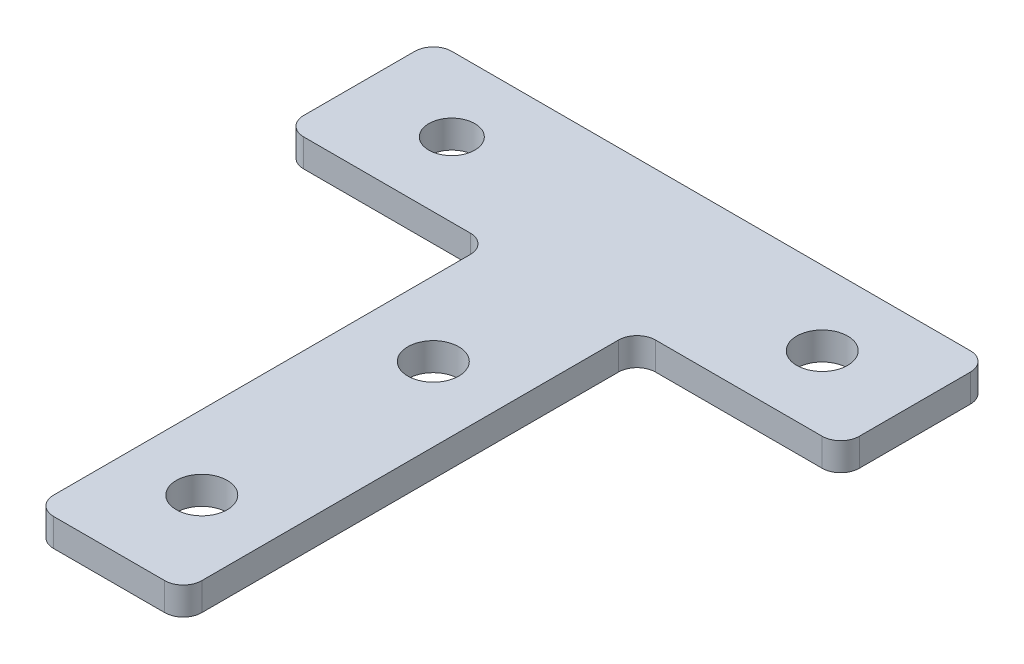
ISO-10303-21;
HEADER;
FILE_DESCRIPTION(('STEP AP214'),'2;1');
FILE_NAME('part.step','',(''),(''),'','','');
FILE_SCHEMA(('AUTOMOTIVE_DESIGN { 1 0 10303 214 1 1 1 1 }'));
ENDSEC;
DATA;
#1=APPLICATION_CONTEXT('core data for automotive mechanical design processes');
#2=APPLICATION_PROTOCOL_DEFINITION('international standard','automotive_design',2000,#1);
#3=PRODUCT_CONTEXT('',#1,'mechanical');
#4=PRODUCT('Part','Part','',(#3));
#5=PRODUCT_RELATED_PRODUCT_CATEGORY('part','',(#4));
#6=PRODUCT_DEFINITION_FORMATION('','',#4);
#7=PRODUCT_DEFINITION_CONTEXT('part definition',#1,'design');
#8=PRODUCT_DEFINITION('design','',#6,#7);
#9=PRODUCT_DEFINITION_SHAPE('','',#8);
#10=(LENGTH_UNIT() NAMED_UNIT(*) SI_UNIT(.MILLI.,.METRE.));
#11=(NAMED_UNIT(*) PLANE_ANGLE_UNIT() SI_UNIT($,.RADIAN.));
#12=(NAMED_UNIT(*) SI_UNIT($,.STERADIAN.) SOLID_ANGLE_UNIT());
#13=UNCERTAINTY_MEASURE_WITH_UNIT(LENGTH_MEASURE(1.E-05),#10,'distance_accuracy_value','');
#14=(GEOMETRIC_REPRESENTATION_CONTEXT(3) GLOBAL_UNCERTAINTY_ASSIGNED_CONTEXT((#13)) GLOBAL_UNIT_ASSIGNED_CONTEXT((#10,
#11,#12)) REPRESENTATION_CONTEXT('',''));
#15=CARTESIAN_POINT('',(0.,0.,0.));
#16=DIRECTION('',(0.,0.,1.));
#17=DIRECTION('',(1.,0.,0.));
#18=AXIS2_PLACEMENT_3D('',#15,#16,#17);
#19=CARTESIAN_POINT('',(20.,3.,18.));
#20=DIRECTION('',(0.,-1.,0.));
#21=DIRECTION('',(0.,0.,-1.));
#22=AXIS2_PLACEMENT_3D('',#19,#20,#21);
#23=PLANE('',#22);
#24=CARTESIAN_POINT('',(20.,3.,18.));
#25=DIRECTION('',(0.,-1.,0.));
#26=DIRECTION('',(0.,0.,-1.));
#27=AXIS2_PLACEMENT_3D('',#24,#25,#26);
#28=CIRCLE('',#27,2.00000000000012);
#29=CARTESIAN_POINT('',(20.,3.,15.9999999999997));
#30=VERTEX_POINT('',#29);
#31=CARTESIAN_POINT('',(22.,3.,18.));
#32=VERTEX_POINT('',#31);
#33=EDGE_CURVE('E242',#30,#32,#28,.T.);
#34=ORIENTED_EDGE('',*,*,#33,.T.);
#35=DIRECTION('',(0.,0.,1.));
#36=VECTOR('',#35,1.);
#37=CARTESIAN_POINT('',(22.,3.,18.));
#38=LINE('',#37,#36);
#39=CARTESIAN_POINT('',(22.,3.,63.));
#40=VERTEX_POINT('',#39);
#41=EDGE_CURVE('E130',#32,#40,#38,.T.);
#42=ORIENTED_EDGE('',*,*,#41,.T.);
#43=CARTESIAN_POINT('',(24.,3.,63.));
#44=DIRECTION('',(0.,1.,0.));
#45=DIRECTION('',(0.,0.,1.));
#46=AXIS2_PLACEMENT_3D('',#43,#44,#45);
#47=CIRCLE('',#46,2.);
#48=CARTESIAN_POINT('',(24.,3.,65.));
#49=VERTEX_POINT('',#48);
#50=EDGE_CURVE('E295',#40,#49,#47,.T.);
#51=ORIENTED_EDGE('',*,*,#50,.T.);
#52=DIRECTION('',(1.,0.,0.));
#53=VECTOR('',#52,1.);
#54=CARTESIAN_POINT('',(24.,3.,65.));
#55=LINE('',#54,#53);
#56=CARTESIAN_POINT('',(36.,3.,65.));
#57=VERTEX_POINT('',#56);
#58=EDGE_CURVE('E315',#49,#57,#55,.T.);
#59=ORIENTED_EDGE('',*,*,#58,.T.);
#60=CARTESIAN_POINT('',(36.,3.,63.));
#61=DIRECTION('',(0.,1.,0.));
#62=DIRECTION('',(0.,0.,1.));
#63=AXIS2_PLACEMENT_3D('',#60,#61,#62);
#64=CIRCLE('',#63,2.);
#65=CARTESIAN_POINT('',(38.,3.,63.));
#66=VERTEX_POINT('',#65);
#67=EDGE_CURVE('E311',#57,#66,#64,.T.);
#68=ORIENTED_EDGE('',*,*,#67,.T.);
#69=DIRECTION('',(0.,0.,-1.));
#70=VECTOR('',#69,1.);
#71=CARTESIAN_POINT('',(38.,3.,63.));
#72=LINE('',#71,#70);
#73=CARTESIAN_POINT('',(38.,3.,18.));
#74=VERTEX_POINT('',#73);
#75=EDGE_CURVE('E314',#66,#74,#72,.T.);
#76=ORIENTED_EDGE('',*,*,#75,.T.);
#77=CARTESIAN_POINT('',(40.,3.,18.));
#78=DIRECTION('',(0.,-1.,0.));
#79=DIRECTION('',(0.,0.,-1.));
#80=AXIS2_PLACEMENT_3D('',#77,#78,#79);
#81=CIRCLE('',#80,2.);
#82=CARTESIAN_POINT('',(40.,3.,16.));
#83=VERTEX_POINT('',#82);
#84=EDGE_CURVE('E319',#74,#83,#81,.T.);
#85=ORIENTED_EDGE('',*,*,#84,.T.);
#86=DIRECTION('',(1.,0.,0.));
#87=VECTOR('',#86,1.);
#88=CARTESIAN_POINT('',(40.,3.,16.));
#89=LINE('',#88,#87);
#90=CARTESIAN_POINT('',(58.,3.,16.));
#91=VERTEX_POINT('',#90);
#92=EDGE_CURVE('E326',#83,#91,#89,.T.);
#93=ORIENTED_EDGE('',*,*,#92,.T.);
#94=CARTESIAN_POINT('',(58.,3.,14.));
#95=DIRECTION('',(0.,1.,0.));
#96=DIRECTION('',(0.,0.,1.));
#97=AXIS2_PLACEMENT_3D('',#94,#95,#96);
#98=CIRCLE('',#97,2.);
#99=CARTESIAN_POINT('',(60.,3.,14.));
#100=VERTEX_POINT('',#99);
#101=EDGE_CURVE('E329',#91,#100,#98,.T.);
#102=ORIENTED_EDGE('',*,*,#101,.T.);
#103=DIRECTION('',(0.,0.,-1.));
#104=VECTOR('',#103,1.);
#105=CARTESIAN_POINT('',(60.,3.,14.));
#106=LINE('',#105,#104);
#107=CARTESIAN_POINT('',(60.,3.,2.00000000000001));
#108=VERTEX_POINT('',#107);
#109=EDGE_CURVE('E332',#100,#108,#106,.T.);
#110=ORIENTED_EDGE('',*,*,#109,.T.);
#111=CARTESIAN_POINT('',(58.,3.,2.));
#112=DIRECTION('',(0.,1.,0.));
#113=DIRECTION('',(0.,0.,1.));
#114=AXIS2_PLACEMENT_3D('',#111,#112,#113);
#115=CIRCLE('',#114,2.);
#116=CARTESIAN_POINT('',(58.,3.,0.));
#117=VERTEX_POINT('',#116);
#118=EDGE_CURVE('E335',#108,#117,#115,.T.);
#119=ORIENTED_EDGE('',*,*,#118,.T.);
#120=DIRECTION('',(-1.,0.,0.));
#121=VECTOR('',#120,1.);
#122=CARTESIAN_POINT('',(58.,3.,0.));
#123=LINE('',#122,#121);
#124=CARTESIAN_POINT('',(2.,3.,0.));
#125=VERTEX_POINT('',#124);
#126=EDGE_CURVE('E338',#117,#125,#123,.T.);
#127=ORIENTED_EDGE('',*,*,#126,.T.);
#128=CARTESIAN_POINT('',(2.,3.,2.));
#129=DIRECTION('',(0.,1.,0.));
#130=DIRECTION('',(0.,0.,-1.));
#131=AXIS2_PLACEMENT_3D('',#128,#129,#130);
#132=CIRCLE('',#131,2.);
#133=CARTESIAN_POINT('',(0.,3.,2.00000000000001));
#134=VERTEX_POINT('',#133);
#135=EDGE_CURVE('E173',#125,#134,#132,.T.);
#136=ORIENTED_EDGE('',*,*,#135,.T.);
#137=DIRECTION('',(0.,0.,1.));
#138=VECTOR('',#137,1.);
#139=CARTESIAN_POINT('',(0.,3.,2.00000000000001));
#140=LINE('',#139,#138);
#141=CARTESIAN_POINT('',(0.,3.,14.));
#142=VERTEX_POINT('',#141);
#143=EDGE_CURVE('E167',#134,#142,#140,.T.);
#144=ORIENTED_EDGE('',*,*,#143,.T.);
#145=CARTESIAN_POINT('',(2.,3.,14.));
#146=DIRECTION('',(0.,1.,0.));
#147=DIRECTION('',(0.,0.,1.));
#148=AXIS2_PLACEMENT_3D('',#145,#146,#147);
#149=CIRCLE('',#148,2.);
#150=CARTESIAN_POINT('',(2.00000000000003,3.,16.));
#151=VERTEX_POINT('',#150);
#152=EDGE_CURVE('E171',#142,#151,#149,.T.);
#153=ORIENTED_EDGE('',*,*,#152,.T.);
#154=DIRECTION('',(1.,0.,0.));
#155=VECTOR('',#154,1.);
#156=CARTESIAN_POINT('',(2.00000000000003,3.,16.));
#157=LINE('',#156,#155);
#158=EDGE_CURVE('E63',#151,#30,#157,.T.);
#159=ORIENTED_EDGE('',*,*,#158,.T.);
#160=EDGE_LOOP('',(#34,#42,#51,#59,#68,#76,#85,#93,#102,#110,#119,#127,#136,#144,#153,#159));
#161=FACE_BOUND('',#160,.T.);
#162=CARTESIAN_POINT('',(10.,3.,8.));
#163=DIRECTION('',(0.,1.,0.));
#164=DIRECTION('',(0.,0.,1.));
#165=AXIS2_PLACEMENT_3D('',#162,#163,#164);
#166=CIRCLE('',#165,2.48553592422511);
#167=CARTESIAN_POINT('',(10.,3.,10.4855359242251));
#168=VERTEX_POINT('',#167);
#169=EDGE_CURVE('E200',#168,#168,#166,.T.);
#170=ORIENTED_EDGE('',*,*,#169,.F.);
#171=EDGE_LOOP('',(#170));
#172=FACE_BOUND('',#171,.T.);
#173=CARTESIAN_POINT('',(50.,3.,8.));
#174=DIRECTION('',(0.,1.,0.));
#175=DIRECTION('',(0.,0.,1.));
#176=AXIS2_PLACEMENT_3D('',#173,#174,#175);
#177=CIRCLE('',#176,2.75);
#178=CARTESIAN_POINT('',(50.,3.,10.75));
#179=VERTEX_POINT('',#178);
#180=EDGE_CURVE('E408',#179,#179,#177,.T.);
#181=ORIENTED_EDGE('',*,*,#180,.F.);
#182=EDGE_LOOP('',(#181));
#183=FACE_BOUND('',#182,.T.);
#184=CARTESIAN_POINT('',(30.,3.,55.));
#185=DIRECTION('',(0.,1.,0.));
#186=DIRECTION('',(0.,0.,1.));
#187=AXIS2_PLACEMENT_3D('',#184,#185,#186);
#188=CIRCLE('',#187,2.75);
#189=CARTESIAN_POINT('',(30.,3.,57.75));
#190=VERTEX_POINT('',#189);
#191=EDGE_CURVE('E400',#190,#190,#188,.T.);
#192=ORIENTED_EDGE('',*,*,#191,.F.);
#193=EDGE_LOOP('',(#192));
#194=FACE_BOUND('',#193,.T.);
#195=CARTESIAN_POINT('',(30.,3.,30.));
#196=DIRECTION('',(0.,1.,0.));
#197=DIRECTION('',(0.,0.,1.));
#198=AXIS2_PLACEMENT_3D('',#195,#196,#197);
#199=CIRCLE('',#198,2.75);
#200=CARTESIAN_POINT('',(30.,3.,32.75));
#201=VERTEX_POINT('',#200);
#202=EDGE_CURVE('E389',#201,#201,#199,.T.);
#203=ORIENTED_EDGE('',*,*,#202,.F.);
#204=EDGE_LOOP('',(#203));
#205=FACE_BOUND('',#204,.T.);
#206=ADVANCED_FACE('F45',(#161,#172,#183,#194,#205),#23,.F.);
#207=CARTESIAN_POINT('',(20.,0.,18.));
#208=DIRECTION('',(0.,-1.,0.));
#209=DIRECTION('',(0.,0.,-1.));
#210=AXIS2_PLACEMENT_3D('',#207,#208,#209);
#211=PLANE('',#210);
#212=CARTESIAN_POINT('',(30.,0.,55.));
#213=DIRECTION('',(0.,1.,0.));
#214=DIRECTION('',(0.,0.,1.));
#215=AXIS2_PLACEMENT_3D('',#212,#213,#214);
#216=CIRCLE('',#215,2.75);
#217=CARTESIAN_POINT('',(30.,0.,57.75));
#218=VERTEX_POINT('',#217);
#219=EDGE_CURVE('E397',#218,#218,#216,.T.);
#220=ORIENTED_EDGE('',*,*,#219,.T.);
#221=EDGE_LOOP('',(#220));
#222=FACE_BOUND('',#221,.T.);
#223=CARTESIAN_POINT('',(10.,0.,8.));
#224=DIRECTION('',(0.,1.,0.));
#225=DIRECTION('',(0.,0.,1.));
#226=AXIS2_PLACEMENT_3D('',#223,#224,#225);
#227=CIRCLE('',#226,2.48553592422511);
#228=CARTESIAN_POINT('',(10.,0.,10.4855359242251));
#229=VERTEX_POINT('',#228);
#230=EDGE_CURVE('E412',#229,#229,#227,.T.);
#231=ORIENTED_EDGE('',*,*,#230,.T.);
#232=EDGE_LOOP('',(#231));
#233=FACE_BOUND('',#232,.T.);
#234=CARTESIAN_POINT('',(20.,0.,18.));
#235=DIRECTION('',(0.,-1.,0.));
#236=DIRECTION('',(0.,0.,-1.));
#237=AXIS2_PLACEMENT_3D('',#234,#235,#236);
#238=CIRCLE('',#237,2.00000000000012);
#239=CARTESIAN_POINT('',(20.,0.,15.9999999999997));
#240=VERTEX_POINT('',#239);
#241=CARTESIAN_POINT('',(22.,0.,18.));
#242=VERTEX_POINT('',#241);
#243=EDGE_CURVE('E195',#240,#242,#238,.T.);
#244=ORIENTED_EDGE('',*,*,#243,.F.);
#245=DIRECTION('',(1.,0.,0.));
#246=VECTOR('',#245,1.);
#247=CARTESIAN_POINT('',(2.00000000000003,0.,16.));
#248=LINE('',#247,#246);
#249=CARTESIAN_POINT('',(2.00000000000003,0.,16.));
#250=VERTEX_POINT('',#249);
#251=EDGE_CURVE('E122',#250,#240,#248,.T.);
#252=ORIENTED_EDGE('',*,*,#251,.F.);
#253=CARTESIAN_POINT('',(2.,0.,14.));
#254=DIRECTION('',(0.,1.,0.));
#255=DIRECTION('',(0.,0.,1.));
#256=AXIS2_PLACEMENT_3D('',#253,#254,#255);
#257=CIRCLE('',#256,2.);
#258=CARTESIAN_POINT('',(0.,0.,14.));
#259=VERTEX_POINT('',#258);
#260=EDGE_CURVE('E116',#259,#250,#257,.T.);
#261=ORIENTED_EDGE('',*,*,#260,.F.);
#262=DIRECTION('',(0.,0.,1.));
#263=VECTOR('',#262,1.);
#264=CARTESIAN_POINT('',(0.,0.,2.00000000000001));
#265=LINE('',#264,#263);
#266=CARTESIAN_POINT('',(0.,0.,2.00000000000001));
#267=VERTEX_POINT('',#266);
#268=EDGE_CURVE('E182',#267,#259,#265,.T.);
#269=ORIENTED_EDGE('',*,*,#268,.F.);
#270=CARTESIAN_POINT('',(2.,0.,2.));
#271=DIRECTION('',(0.,1.,0.));
#272=DIRECTION('',(0.,0.,-1.));
#273=AXIS2_PLACEMENT_3D('',#270,#271,#272);
#274=CIRCLE('',#273,2.);
#275=CARTESIAN_POINT('',(2.,0.,0.));
#276=VERTEX_POINT('',#275);
#277=EDGE_CURVE('E233',#276,#267,#274,.T.);
#278=ORIENTED_EDGE('',*,*,#277,.F.);
#279=DIRECTION('',(-1.,0.,0.));
#280=VECTOR('',#279,1.);
#281=CARTESIAN_POINT('',(58.,0.,0.));
#282=LINE('',#281,#280);
#283=CARTESIAN_POINT('',(58.,0.,0.));
#284=VERTEX_POINT('',#283);
#285=EDGE_CURVE('E230',#284,#276,#282,.T.);
#286=ORIENTED_EDGE('',*,*,#285,.F.);
#287=CARTESIAN_POINT('',(58.,0.,2.));
#288=DIRECTION('',(0.,1.,0.));
#289=DIRECTION('',(0.,0.,1.));
#290=AXIS2_PLACEMENT_3D('',#287,#288,#289);
#291=CIRCLE('',#290,2.);
#292=CARTESIAN_POINT('',(60.,0.,2.00000000000001));
#293=VERTEX_POINT('',#292);
#294=EDGE_CURVE('E227',#293,#284,#291,.T.);
#295=ORIENTED_EDGE('',*,*,#294,.F.);
#296=DIRECTION('',(0.,0.,-1.));
#297=VECTOR('',#296,1.);
#298=CARTESIAN_POINT('',(60.,0.,14.));
#299=LINE('',#298,#297);
#300=CARTESIAN_POINT('',(60.,0.,14.));
#301=VERTEX_POINT('',#300);
#302=EDGE_CURVE('E224',#301,#293,#299,.T.);
#303=ORIENTED_EDGE('',*,*,#302,.F.);
#304=CARTESIAN_POINT('',(58.,0.,14.));
#305=DIRECTION('',(0.,1.,0.));
#306=DIRECTION('',(0.,0.,1.));
#307=AXIS2_PLACEMENT_3D('',#304,#305,#306);
#308=CIRCLE('',#307,2.);
#309=CARTESIAN_POINT('',(58.,0.,16.));
#310=VERTEX_POINT('',#309);
#311=EDGE_CURVE('E221',#310,#301,#308,.T.);
#312=ORIENTED_EDGE('',*,*,#311,.F.);
#313=DIRECTION('',(1.,0.,0.));
#314=VECTOR('',#313,1.);
#315=CARTESIAN_POINT('',(40.,0.,16.));
#316=LINE('',#315,#314);
#317=CARTESIAN_POINT('',(40.,0.,16.));
#318=VERTEX_POINT('',#317);
#319=EDGE_CURVE('E218',#318,#310,#316,.T.);
#320=ORIENTED_EDGE('',*,*,#319,.F.);
#321=CARTESIAN_POINT('',(40.,0.,18.));
#322=DIRECTION('',(0.,-1.,0.));
#323=DIRECTION('',(0.,0.,-1.));
#324=AXIS2_PLACEMENT_3D('',#321,#322,#323);
#325=CIRCLE('',#324,2.);
#326=CARTESIAN_POINT('',(38.,0.,18.));
#327=VERTEX_POINT('',#326);
#328=EDGE_CURVE('E215',#327,#318,#325,.T.);
#329=ORIENTED_EDGE('',*,*,#328,.F.);
#330=DIRECTION('',(0.,0.,-1.));
#331=VECTOR('',#330,1.);
#332=CARTESIAN_POINT('',(38.,0.,63.));
#333=LINE('',#332,#331);
#334=CARTESIAN_POINT('',(38.,0.,63.));
#335=VERTEX_POINT('',#334);
#336=EDGE_CURVE('E212',#335,#327,#333,.T.);
#337=ORIENTED_EDGE('',*,*,#336,.F.);
#338=CARTESIAN_POINT('',(36.,0.,63.));
#339=DIRECTION('',(0.,1.,0.));
#340=DIRECTION('',(0.,0.,1.));
#341=AXIS2_PLACEMENT_3D('',#338,#339,#340);
#342=CIRCLE('',#341,2.);
#343=CARTESIAN_POINT('',(36.,0.,65.));
#344=VERTEX_POINT('',#343);
#345=EDGE_CURVE('E209',#344,#335,#342,.T.);
#346=ORIENTED_EDGE('',*,*,#345,.F.);
#347=DIRECTION('',(1.,0.,0.));
#348=VECTOR('',#347,1.);
#349=CARTESIAN_POINT('',(24.,0.,65.));
#350=LINE('',#349,#348);
#351=CARTESIAN_POINT('',(24.,0.,65.));
#352=VERTEX_POINT('',#351);
#353=EDGE_CURVE('E206',#352,#344,#350,.T.);
#354=ORIENTED_EDGE('',*,*,#353,.F.);
#355=CARTESIAN_POINT('',(24.,0.,63.));
#356=DIRECTION('',(0.,1.,0.));
#357=DIRECTION('',(0.,0.,1.));
#358=AXIS2_PLACEMENT_3D('',#355,#356,#357);
#359=CIRCLE('',#358,2.);
#360=CARTESIAN_POINT('',(22.,0.,63.));
#361=VERTEX_POINT('',#360);
#362=EDGE_CURVE('E203',#361,#352,#359,.T.);
#363=ORIENTED_EDGE('',*,*,#362,.F.);
#364=DIRECTION('',(0.,0.,1.));
#365=VECTOR('',#364,1.);
#366=CARTESIAN_POINT('',(22.,0.,18.));
#367=LINE('',#366,#365);
#368=EDGE_CURVE('E199',#242,#361,#367,.T.);
#369=ORIENTED_EDGE('',*,*,#368,.F.);
#370=EDGE_LOOP('',(#244,#252,#261,#269,#278,#286,#295,#303,#312,#320,#329,#337,#346,#354,#363,#369));
#371=FACE_BOUND('',#370,.T.);
#372=CARTESIAN_POINT('',(50.,0.,8.));
#373=DIRECTION('',(0.,1.,0.));
#374=DIRECTION('',(0.,0.,1.));
#375=AXIS2_PLACEMENT_3D('',#372,#373,#374);
#376=CIRCLE('',#375,2.75);
#377=CARTESIAN_POINT('',(50.,0.,10.75));
#378=VERTEX_POINT('',#377);
#379=EDGE_CURVE('E404',#378,#378,#376,.T.);
#380=ORIENTED_EDGE('',*,*,#379,.T.);
#381=EDGE_LOOP('',(#380));
#382=FACE_BOUND('',#381,.T.);
#383=CARTESIAN_POINT('',(30.,0.,30.));
#384=DIRECTION('',(0.,1.,0.));
#385=DIRECTION('',(0.,0.,1.));
#386=AXIS2_PLACEMENT_3D('',#383,#384,#385);
#387=CIRCLE('',#386,2.75);
#388=CARTESIAN_POINT('',(30.,0.,32.75));
#389=VERTEX_POINT('',#388);
#390=EDGE_CURVE('E392',#389,#389,#387,.T.);
#391=ORIENTED_EDGE('',*,*,#390,.T.);
#392=EDGE_LOOP('',(#391));
#393=FACE_BOUND('',#392,.T.);
#394=ADVANCED_FACE('F299',(#222,#233,#371,#382,#393),#211,.T.);
#395=CARTESIAN_POINT('',(20.,3.,18.));
#396=DIRECTION('',(0.,-1.,0.));
#397=DIRECTION('',(0.,0.,-1.));
#398=AXIS2_PLACEMENT_3D('',#395,#396,#397);
#399=CYLINDRICAL_SURFACE('',#398,2.00000000000012);
#400=ORIENTED_EDGE('',*,*,#243,.T.);
#401=DIRECTION('',(0.,-1.,0.));
#402=VECTOR('',#401,1.);
#403=CARTESIAN_POINT('',(22.,3.,18.));
#404=LINE('',#403,#402);
#405=EDGE_CURVE('E11',#32,#242,#404,.T.);
#406=ORIENTED_EDGE('',*,*,#405,.F.);
#407=ORIENTED_EDGE('',*,*,#33,.F.);
#408=DIRECTION('',(0.,-1.,0.));
#409=VECTOR('',#408,1.);
#410=CARTESIAN_POINT('',(20.,3.,15.9999999999997));
#411=LINE('',#410,#409);
#412=EDGE_CURVE('E191',#30,#240,#411,.T.);
#413=ORIENTED_EDGE('',*,*,#412,.T.);
#414=EDGE_LOOP('',(#400,#406,#407,#413));
#415=FACE_BOUND('',#414,.T.);
#416=ADVANCED_FACE('F47',(#415),#399,.F.);
#417=CARTESIAN_POINT('',(22.,3.,18.));
#418=DIRECTION('',(1.,0.,0.));
#419=DIRECTION('',(0.,0.,-1.));
#420=AXIS2_PLACEMENT_3D('',#417,#418,#419);
#421=PLANE('',#420);
#422=ORIENTED_EDGE('',*,*,#368,.T.);
#423=DIRECTION('',(0.,-1.,0.));
#424=VECTOR('',#423,1.);
#425=CARTESIAN_POINT('',(22.,3.,63.));
#426=LINE('',#425,#424);
#427=EDGE_CURVE('E55',#40,#361,#426,.T.);
#428=ORIENTED_EDGE('',*,*,#427,.F.);
#429=ORIENTED_EDGE('',*,*,#41,.F.);
#430=ORIENTED_EDGE('',*,*,#405,.T.);
#431=EDGE_LOOP('',(#422,#428,#429,#430));
#432=FACE_BOUND('',#431,.T.);
#433=ADVANCED_FACE('F574',(#432),#421,.F.);
#434=CARTESIAN_POINT('',(24.,3.,63.));
#435=DIRECTION('',(0.,-1.,0.));
#436=DIRECTION('',(0.,0.,-1.));
#437=AXIS2_PLACEMENT_3D('',#434,#435,#436);
#438=CYLINDRICAL_SURFACE('',#437,2.);
#439=ORIENTED_EDGE('',*,*,#362,.T.);
#440=DIRECTION('',(0.,-1.,0.));
#441=VECTOR('',#440,1.);
#442=CARTESIAN_POINT('',(24.,3.,65.));
#443=LINE('',#442,#441);
#444=EDGE_CURVE('E285',#49,#352,#443,.T.);
#445=ORIENTED_EDGE('',*,*,#444,.F.);
#446=ORIENTED_EDGE('',*,*,#50,.F.);
#447=ORIENTED_EDGE('',*,*,#427,.T.);
#448=EDGE_LOOP('',(#439,#445,#446,#447));
#449=FACE_BOUND('',#448,.T.);
#450=ADVANCED_FACE('F293',(#449),#438,.T.);
#451=CARTESIAN_POINT('',(24.,3.,65.));
#452=DIRECTION('',(0.,0.,-1.));
#453=DIRECTION('',(-1.,0.,0.));
#454=AXIS2_PLACEMENT_3D('',#451,#452,#453);
#455=PLANE('',#454);
#456=ORIENTED_EDGE('',*,*,#353,.T.);
#457=DIRECTION('',(0.,-1.,0.));
#458=VECTOR('',#457,1.);
#459=CARTESIAN_POINT('',(36.,3.,65.));
#460=LINE('',#459,#458);
#461=EDGE_CURVE('E281',#57,#344,#460,.T.);
#462=ORIENTED_EDGE('',*,*,#461,.F.);
#463=ORIENTED_EDGE('',*,*,#58,.F.);
#464=ORIENTED_EDGE('',*,*,#444,.T.);
#465=EDGE_LOOP('',(#456,#462,#463,#464));
#466=FACE_BOUND('',#465,.T.);
#467=ADVANCED_FACE('F305',(#466),#455,.F.);
#468=CARTESIAN_POINT('',(36.,3.,63.));
#469=DIRECTION('',(0.,-1.,0.));
#470=DIRECTION('',(0.,0.,-1.));
#471=AXIS2_PLACEMENT_3D('',#468,#469,#470);
#472=CYLINDRICAL_SURFACE('',#471,2.);
#473=ORIENTED_EDGE('',*,*,#345,.T.);
#474=DIRECTION('',(0.,-1.,0.));
#475=VECTOR('',#474,1.);
#476=CARTESIAN_POINT('',(38.,3.,63.));
#477=LINE('',#476,#475);
#478=EDGE_CURVE('E277',#66,#335,#477,.T.);
#479=ORIENTED_EDGE('',*,*,#478,.F.);
#480=ORIENTED_EDGE('',*,*,#67,.F.);
#481=ORIENTED_EDGE('',*,*,#461,.T.);
#482=EDGE_LOOP('',(#473,#479,#480,#481));
#483=FACE_BOUND('',#482,.T.);
#484=ADVANCED_FACE('F309',(#483),#472,.T.);
#485=CARTESIAN_POINT('',(38.,3.,63.));
#486=DIRECTION('',(-1.,0.,0.));
#487=DIRECTION('',(0.,0.,1.));
#488=AXIS2_PLACEMENT_3D('',#485,#486,#487);
#489=PLANE('',#488);
#490=ORIENTED_EDGE('',*,*,#336,.T.);
#491=DIRECTION('',(0.,-1.,0.));
#492=VECTOR('',#491,1.);
#493=CARTESIAN_POINT('',(38.,3.,18.));
#494=LINE('',#493,#492);
#495=EDGE_CURVE('E273',#74,#327,#494,.T.);
#496=ORIENTED_EDGE('',*,*,#495,.F.);
#497=ORIENTED_EDGE('',*,*,#75,.F.);
#498=ORIENTED_EDGE('',*,*,#478,.T.);
#499=EDGE_LOOP('',(#490,#496,#497,#498));
#500=FACE_BOUND('',#499,.T.);
#501=ADVANCED_FACE('F539',(#500),#489,.F.);
#502=CARTESIAN_POINT('',(40.,3.,18.));
#503=DIRECTION('',(0.,-1.,0.));
#504=DIRECTION('',(0.,0.,-1.));
#505=AXIS2_PLACEMENT_3D('',#502,#503,#504);
#506=CYLINDRICAL_SURFACE('',#505,2.);
#507=ORIENTED_EDGE('',*,*,#328,.T.);
#508=DIRECTION('',(0.,-1.,0.));
#509=VECTOR('',#508,1.);
#510=CARTESIAN_POINT('',(40.,3.,16.));
#511=LINE('',#510,#509);
#512=EDGE_CURVE('E269',#83,#318,#511,.T.);
#513=ORIENTED_EDGE('',*,*,#512,.F.);
#514=ORIENTED_EDGE('',*,*,#84,.F.);
#515=ORIENTED_EDGE('',*,*,#495,.T.);
#516=EDGE_LOOP('',(#507,#513,#514,#515));
#517=FACE_BOUND('',#516,.T.);
#518=ADVANCED_FACE('F529',(#517),#506,.F.);
#519=CARTESIAN_POINT('',(40.,3.,16.));
#520=DIRECTION('',(0.,0.,-1.));
#521=DIRECTION('',(-1.,0.,0.));
#522=AXIS2_PLACEMENT_3D('',#519,#520,#521);
#523=PLANE('',#522);
#524=ORIENTED_EDGE('',*,*,#319,.T.);
#525=DIRECTION('',(0.,-1.,0.));
#526=VECTOR('',#525,1.);
#527=CARTESIAN_POINT('',(58.,3.,16.));
#528=LINE('',#527,#526);
#529=EDGE_CURVE('E265',#91,#310,#528,.T.);
#530=ORIENTED_EDGE('',*,*,#529,.F.);
#531=ORIENTED_EDGE('',*,*,#92,.F.);
#532=ORIENTED_EDGE('',*,*,#512,.T.);
#533=EDGE_LOOP('',(#524,#530,#531,#532));
#534=FACE_BOUND('',#533,.T.);
#535=ADVANCED_FACE('F519',(#534),#523,.F.);
#536=CARTESIAN_POINT('',(58.,3.,14.));
#537=DIRECTION('',(0.,-1.,0.));
#538=DIRECTION('',(0.,0.,-1.));
#539=AXIS2_PLACEMENT_3D('',#536,#537,#538);
#540=CYLINDRICAL_SURFACE('',#539,2.);
#541=ORIENTED_EDGE('',*,*,#311,.T.);
#542=DIRECTION('',(0.,-1.,0.));
#543=VECTOR('',#542,1.);
#544=CARTESIAN_POINT('',(60.,3.,14.));
#545=LINE('',#544,#543);
#546=EDGE_CURVE('E261',#100,#301,#545,.T.);
#547=ORIENTED_EDGE('',*,*,#546,.F.);
#548=ORIENTED_EDGE('',*,*,#101,.F.);
#549=ORIENTED_EDGE('',*,*,#529,.T.);
#550=EDGE_LOOP('',(#541,#547,#548,#549));
#551=FACE_BOUND('',#550,.T.);
#552=ADVANCED_FACE('F509',(#551),#540,.T.);
#553=CARTESIAN_POINT('',(60.,3.,14.));
#554=DIRECTION('',(-1.,0.,0.));
#555=DIRECTION('',(0.,0.,1.));
#556=AXIS2_PLACEMENT_3D('',#553,#554,#555);
#557=PLANE('',#556);
#558=ORIENTED_EDGE('',*,*,#302,.T.);
#559=DIRECTION('',(0.,-1.,0.));
#560=VECTOR('',#559,1.);
#561=CARTESIAN_POINT('',(60.,3.,2.00000000000001));
#562=LINE('',#561,#560);
#563=EDGE_CURVE('E257',#108,#293,#562,.T.);
#564=ORIENTED_EDGE('',*,*,#563,.F.);
#565=ORIENTED_EDGE('',*,*,#109,.F.);
#566=ORIENTED_EDGE('',*,*,#546,.T.);
#567=EDGE_LOOP('',(#558,#564,#565,#566));
#568=FACE_BOUND('',#567,.T.);
#569=ADVANCED_FACE('F499',(#568),#557,.F.);
#570=CARTESIAN_POINT('',(58.,3.,2.));
#571=DIRECTION('',(0.,-1.,0.));
#572=DIRECTION('',(0.,0.,-1.));
#573=AXIS2_PLACEMENT_3D('',#570,#571,#572);
#574=CYLINDRICAL_SURFACE('',#573,2.);
#575=ORIENTED_EDGE('',*,*,#294,.T.);
#576=DIRECTION('',(0.,-1.,0.));
#577=VECTOR('',#576,1.);
#578=CARTESIAN_POINT('',(58.,3.,0.));
#579=LINE('',#578,#577);
#580=EDGE_CURVE('E253',#117,#284,#579,.T.);
#581=ORIENTED_EDGE('',*,*,#580,.F.);
#582=ORIENTED_EDGE('',*,*,#118,.F.);
#583=ORIENTED_EDGE('',*,*,#563,.T.);
#584=EDGE_LOOP('',(#575,#581,#582,#583));
#585=FACE_BOUND('',#584,.T.);
#586=ADVANCED_FACE('F490',(#585),#574,.T.);
#587=CARTESIAN_POINT('',(58.,3.,0.));
#588=DIRECTION('',(0.,0.,1.));
#589=DIRECTION('',(1.,0.,0.));
#590=AXIS2_PLACEMENT_3D('',#587,#588,#589);
#591=PLANE('',#590);
#592=ORIENTED_EDGE('',*,*,#285,.T.);
#593=DIRECTION('',(0.,-1.,0.));
#594=VECTOR('',#593,1.);
#595=CARTESIAN_POINT('',(2.,3.,0.));
#596=LINE('',#595,#594);
#597=EDGE_CURVE('E249',#125,#276,#596,.T.);
#598=ORIENTED_EDGE('',*,*,#597,.F.);
#599=ORIENTED_EDGE('',*,*,#126,.F.);
#600=ORIENTED_EDGE('',*,*,#580,.T.);
#601=EDGE_LOOP('',(#592,#598,#599,#600));
#602=FACE_BOUND('',#601,.T.);
#603=ADVANCED_FACE('F346',(#602),#591,.F.);
#604=CARTESIAN_POINT('',(2.,3.,2.));
#605=DIRECTION('',(0.,-1.,0.));
#606=DIRECTION('',(0.,0.,-1.));
#607=AXIS2_PLACEMENT_3D('',#604,#605,#606);
#608=CYLINDRICAL_SURFACE('',#607,2.);
#609=ORIENTED_EDGE('',*,*,#277,.T.);
#610=DIRECTION('',(0.,-1.,0.));
#611=VECTOR('',#610,1.);
#612=CARTESIAN_POINT('',(0.,3.,2.00000000000001));
#613=LINE('',#612,#611);
#614=EDGE_CURVE('E184',#134,#267,#613,.T.);
#615=ORIENTED_EDGE('',*,*,#614,.F.);
#616=ORIENTED_EDGE('',*,*,#135,.F.);
#617=ORIENTED_EDGE('',*,*,#597,.T.);
#618=EDGE_LOOP('',(#609,#615,#616,#617));
#619=FACE_BOUND('',#618,.T.);
#620=ADVANCED_FACE('F350',(#619),#608,.T.);
#621=CARTESIAN_POINT('',(0.,3.,2.00000000000001));
#622=DIRECTION('',(1.,0.,0.));
#623=DIRECTION('',(0.,0.,-1.));
#624=AXIS2_PLACEMENT_3D('',#621,#622,#623);
#625=PLANE('',#624);
#626=ORIENTED_EDGE('',*,*,#268,.T.);
#627=DIRECTION('',(0.,-1.,0.));
#628=VECTOR('',#627,1.);
#629=CARTESIAN_POINT('',(0.,3.,14.));
#630=LINE('',#629,#628);
#631=EDGE_CURVE('E179',#142,#259,#630,.T.);
#632=ORIENTED_EDGE('',*,*,#631,.F.);
#633=ORIENTED_EDGE('',*,*,#143,.F.);
#634=ORIENTED_EDGE('',*,*,#614,.T.);
#635=EDGE_LOOP('',(#626,#632,#633,#634));
#636=FACE_BOUND('',#635,.T.);
#637=ADVANCED_FACE('F180',(#636),#625,.F.);
#638=CARTESIAN_POINT('',(2.,3.,14.));
#639=DIRECTION('',(0.,-1.,0.));
#640=DIRECTION('',(0.,0.,-1.));
#641=AXIS2_PLACEMENT_3D('',#638,#639,#640);
#642=CYLINDRICAL_SURFACE('',#641,2.);
#643=ORIENTED_EDGE('',*,*,#260,.T.);
#644=DIRECTION('',(0.,-1.,0.));
#645=VECTOR('',#644,1.);
#646=CARTESIAN_POINT('',(2.00000000000003,3.,16.));
#647=LINE('',#646,#645);
#648=EDGE_CURVE('E185',#151,#250,#647,.T.);
#649=ORIENTED_EDGE('',*,*,#648,.F.);
#650=ORIENTED_EDGE('',*,*,#152,.F.);
#651=ORIENTED_EDGE('',*,*,#631,.T.);
#652=EDGE_LOOP('',(#643,#649,#650,#651));
#653=FACE_BOUND('',#652,.T.);
#654=ADVANCED_FACE('F187',(#653),#642,.T.);
#655=CARTESIAN_POINT('',(2.00000000000003,3.,16.));
#656=DIRECTION('',(0.,0.,-1.));
#657=DIRECTION('',(-1.,0.,0.));
#658=AXIS2_PLACEMENT_3D('',#655,#656,#657);
#659=PLANE('',#658);
#660=ORIENTED_EDGE('',*,*,#251,.T.);
#661=ORIENTED_EDGE('',*,*,#412,.F.);
#662=ORIENTED_EDGE('',*,*,#158,.F.);
#663=ORIENTED_EDGE('',*,*,#648,.T.);
#664=EDGE_LOOP('',(#660,#661,#662,#663));
#665=FACE_BOUND('',#664,.T.);
#666=ADVANCED_FACE('F354',(#665),#659,.F.);
#667=CARTESIAN_POINT('',(10.,3.,8.));
#668=DIRECTION('',(0.,-1.,0.));
#669=DIRECTION('',(0.,0.,-1.));
#670=AXIS2_PLACEMENT_3D('',#667,#668,#669);
#671=CYLINDRICAL_SURFACE('',#670,2.48553592422511);
#672=ORIENTED_EDGE('',*,*,#169,.T.);
#673=EDGE_LOOP('',(#672));
#674=FACE_BOUND('',#673,.T.);
#675=ORIENTED_EDGE('',*,*,#230,.F.);
#676=EDGE_LOOP('',(#675));
#677=FACE_BOUND('',#676,.T.);
#678=ADVANCED_FACE('F356',(#674,#677),#671,.F.);
#679=CARTESIAN_POINT('',(50.,3.,8.));
#680=DIRECTION('',(0.,-1.,0.));
#681=DIRECTION('',(0.,0.,-1.));
#682=AXIS2_PLACEMENT_3D('',#679,#680,#681);
#683=CYLINDRICAL_SURFACE('',#682,2.75);
#684=ORIENTED_EDGE('',*,*,#180,.T.);
#685=EDGE_LOOP('',(#684));
#686=FACE_BOUND('',#685,.T.);
#687=ORIENTED_EDGE('',*,*,#379,.F.);
#688=EDGE_LOOP('',(#687));
#689=FACE_BOUND('',#688,.T.);
#690=ADVANCED_FACE('F362',(#686,#689),#683,.F.);
#691=CARTESIAN_POINT('',(30.,3.,55.));
#692=DIRECTION('',(0.,-1.,0.));
#693=DIRECTION('',(0.,0.,-1.));
#694=AXIS2_PLACEMENT_3D('',#691,#692,#693);
#695=CYLINDRICAL_SURFACE('',#694,2.75);
#696=ORIENTED_EDGE('',*,*,#191,.T.);
#697=EDGE_LOOP('',(#696));
#698=FACE_BOUND('',#697,.T.);
#699=ORIENTED_EDGE('',*,*,#219,.F.);
#700=EDGE_LOOP('',(#699));
#701=FACE_BOUND('',#700,.T.);
#702=ADVANCED_FACE('F376',(#698,#701),#695,.F.);
#703=CARTESIAN_POINT('',(30.,3.,30.));
#704=DIRECTION('',(0.,-1.,0.));
#705=DIRECTION('',(0.,0.,-1.));
#706=AXIS2_PLACEMENT_3D('',#703,#704,#705);
#707=CYLINDRICAL_SURFACE('',#706,2.75);
#708=ORIENTED_EDGE('',*,*,#202,.T.);
#709=EDGE_LOOP('',(#708));
#710=FACE_BOUND('',#709,.T.);
#711=ORIENTED_EDGE('',*,*,#390,.F.);
#712=EDGE_LOOP('',(#711));
#713=FACE_BOUND('',#712,.T.);
#714=ADVANCED_FACE('F380',(#710,#713),#707,.F.);
#715=CLOSED_SHELL('',(#206,#394,#416,#433,#450,#467,#484,#501,#518,#535,#552,#569,#586,#603,
#620,#637,#654,#666,#678,#690,#702,#714));
#716=MANIFOLD_SOLID_BREP('B2',#715);
#717=ADVANCED_BREP_SHAPE_REPRESENTATION('',(#18,#716),#14);
#718=SHAPE_DEFINITION_REPRESENTATION(#9,#717);
ENDSEC;
END-ISO-10303-21;
